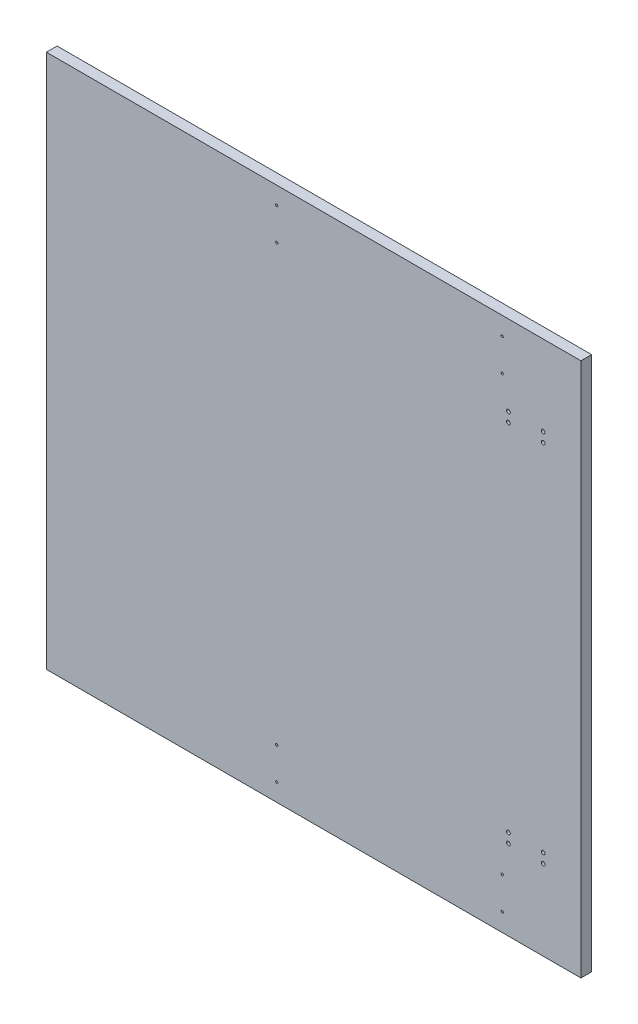
ISO-10303-21;
HEADER;
FILE_DESCRIPTION(('STEP AP214'),'2;1');
FILE_NAME('part.step','',(''),(''),'','','');
FILE_SCHEMA(('AUTOMOTIVE_DESIGN { 1 0 10303 214 1 1 1 1 }'));
ENDSEC;
DATA;
#1=APPLICATION_CONTEXT('core data for automotive mechanical design processes');
#2=APPLICATION_PROTOCOL_DEFINITION('international standard','automotive_design',2000,#1);
#3=PRODUCT_CONTEXT('',#1,'mechanical');
#4=PRODUCT('Part','Part','',(#3));
#5=PRODUCT_RELATED_PRODUCT_CATEGORY('part','',(#4));
#6=PRODUCT_DEFINITION_FORMATION('','',#4);
#7=PRODUCT_DEFINITION_CONTEXT('part definition',#1,'design');
#8=PRODUCT_DEFINITION('design','',#6,#7);
#9=PRODUCT_DEFINITION_SHAPE('','',#8);
#10=(LENGTH_UNIT() NAMED_UNIT(*) SI_UNIT(.MILLI.,.METRE.));
#11=(NAMED_UNIT(*) PLANE_ANGLE_UNIT() SI_UNIT($,.RADIAN.));
#12=(NAMED_UNIT(*) SI_UNIT($,.STERADIAN.) SOLID_ANGLE_UNIT());
#13=UNCERTAINTY_MEASURE_WITH_UNIT(LENGTH_MEASURE(1.E-05),#10,'distance_accuracy_value','');
#14=(GEOMETRIC_REPRESENTATION_CONTEXT(3) GLOBAL_UNCERTAINTY_ASSIGNED_CONTEXT((#13)) GLOBAL_UNIT_ASSIGNED_CONTEXT((#10,
#11,#12)) REPRESENTATION_CONTEXT('',''));
#15=CARTESIAN_POINT('',(0.,0.,0.));
#16=DIRECTION('',(0.,0.,1.));
#17=DIRECTION('',(1.,0.,0.));
#18=AXIS2_PLACEMENT_3D('',#15,#16,#17);
#19=CARTESIAN_POINT('',(0.,0.,0.));
#20=DIRECTION('',(0.,0.,-1.));
#21=DIRECTION('',(-1.,0.,0.));
#22=AXIS2_PLACEMENT_3D('',#19,#20,#21);
#23=PLANE('',#22);
#24=CARTESIAN_POINT('',(-69.0900000000001,-467.1625,0.));
#25=DIRECTION('',(0.,0.,1.));
#26=DIRECTION('',(1.,0.,0.));
#27=AXIS2_PLACEMENT_3D('',#24,#25,#26);
#28=CIRCLE('',#27,2.09999999999999);
#29=CARTESIAN_POINT('',(-66.9900000000001,-467.1625,0.));
#30=VERTEX_POINT('',#29);
#31=EDGE_CURVE('E207',#30,#30,#28,.T.);
#32=ORIENTED_EDGE('',*,*,#31,.T.);
#33=EDGE_LOOP('',(#32));
#34=FACE_BOUND('',#33,.T.);
#35=CARTESIAN_POINT('',(352.804,-405.8375,0.));
#36=DIRECTION('',(0.,0.,1.));
#37=DIRECTION('',(1.,0.,0.));
#38=AXIS2_PLACEMENT_3D('',#35,#36,#37);
#39=CIRCLE('',#38,2.09999999999999);
#40=CARTESIAN_POINT('',(354.904,-405.8375,0.));
#41=VERTEX_POINT('',#40);
#42=EDGE_CURVE('E195',#41,#41,#39,.T.);
#43=ORIENTED_EDGE('',*,*,#42,.T.);
#44=EDGE_LOOP('',(#43));
#45=FACE_BOUND('',#44,.T.);
#46=CARTESIAN_POINT('',(364.35,-350.,0.));
#47=DIRECTION('',(0.,0.,1.));
#48=DIRECTION('',(1.,0.,0.));
#49=AXIS2_PLACEMENT_3D('',#46,#47,#48);
#50=CIRCLE('',#49,3.5);
#51=CARTESIAN_POINT('',(367.85,-350.,0.));
#52=VERTEX_POINT('',#51);
#53=EDGE_CURVE('E189',#52,#52,#50,.T.);
#54=ORIENTED_EDGE('',*,*,#53,.T.);
#55=EDGE_LOOP('',(#54));
#56=FACE_BOUND('',#55,.T.);
#57=CARTESIAN_POINT('',(364.35,-332.,0.));
#58=DIRECTION('',(0.,0.,1.));
#59=DIRECTION('',(1.,0.,0.));
#60=AXIS2_PLACEMENT_3D('',#57,#58,#59);
#61=CIRCLE('',#60,3.5);
#62=CARTESIAN_POINT('',(367.85,-332.,0.));
#63=VERTEX_POINT('',#62);
#64=EDGE_CURVE('E183',#63,#63,#61,.T.);
#65=ORIENTED_EDGE('',*,*,#64,.T.);
#66=EDGE_LOOP('',(#65));
#67=FACE_BOUND('',#66,.T.);
#68=CARTESIAN_POINT('',(429.35,-332.,0.));
#69=DIRECTION('',(0.,0.,1.));
#70=DIRECTION('',(1.,0.,0.));
#71=AXIS2_PLACEMENT_3D('',#68,#69,#70);
#72=CIRCLE('',#71,3.5);
#73=CARTESIAN_POINT('',(432.85,-332.,0.));
#74=VERTEX_POINT('',#73);
#75=EDGE_CURVE('E177',#74,#74,#72,.T.);
#76=ORIENTED_EDGE('',*,*,#75,.T.);
#77=EDGE_LOOP('',(#76));
#78=FACE_BOUND('',#77,.T.);
#79=CARTESIAN_POINT('',(429.35,-350.,0.));
#80=DIRECTION('',(0.,0.,1.));
#81=DIRECTION('',(1.,0.,0.));
#82=AXIS2_PLACEMENT_3D('',#79,#80,#81);
#83=CIRCLE('',#82,3.5);
#84=CARTESIAN_POINT('',(432.85,-350.,0.));
#85=VERTEX_POINT('',#84);
#86=EDGE_CURVE('E171',#85,#85,#83,.T.);
#87=ORIENTED_EDGE('',*,*,#86,.T.);
#88=EDGE_LOOP('',(#87));
#89=FACE_BOUND('',#88,.T.);
#90=CARTESIAN_POINT('',(-69.0900000000001,406.8375,0.));
#91=DIRECTION('',(0.,0.,1.));
#92=DIRECTION('',(1.,0.,0.));
#93=AXIS2_PLACEMENT_3D('',#90,#91,#92);
#94=CIRCLE('',#93,2.09999999999999);
#95=CARTESIAN_POINT('',(-66.9900000000001,406.8375,0.));
#96=VERTEX_POINT('',#95);
#97=EDGE_CURVE('E165',#96,#96,#94,.T.);
#98=ORIENTED_EDGE('',*,*,#97,.T.);
#99=EDGE_LOOP('',(#98));
#100=FACE_BOUND('',#99,.T.);
#101=CARTESIAN_POINT('',(-69.0900000000001,467.1625,0.));
#102=DIRECTION('',(0.,0.,1.));
#103=DIRECTION('',(1.,0.,0.));
#104=AXIS2_PLACEMENT_3D('',#101,#102,#103);
#105=CIRCLE('',#104,2.09999999999999);
#106=CARTESIAN_POINT('',(-66.9900000000001,467.1625,0.));
#107=VERTEX_POINT('',#106);
#108=EDGE_CURVE('E159',#107,#107,#105,.T.);
#109=ORIENTED_EDGE('',*,*,#108,.T.);
#110=EDGE_LOOP('',(#109));
#111=FACE_BOUND('',#110,.T.);
#112=CARTESIAN_POINT('',(352.804,466.1625,0.));
#113=DIRECTION('',(0.,0.,1.));
#114=DIRECTION('',(1.,0.,0.));
#115=AXIS2_PLACEMENT_3D('',#112,#113,#114);
#116=CIRCLE('',#115,2.09999999999999);
#117=CARTESIAN_POINT('',(354.904,466.1625,0.));
#118=VERTEX_POINT('',#117);
#119=EDGE_CURVE('E153',#118,#118,#116,.T.);
#120=ORIENTED_EDGE('',*,*,#119,.T.);
#121=EDGE_LOOP('',(#120));
#122=FACE_BOUND('',#121,.T.);
#123=CARTESIAN_POINT('',(352.804,405.8375,0.));
#124=DIRECTION('',(0.,0.,1.));
#125=DIRECTION('',(1.,0.,0.));
#126=AXIS2_PLACEMENT_3D('',#123,#124,#125);
#127=CIRCLE('',#126,2.09999999999999);
#128=CARTESIAN_POINT('',(354.904,405.8375,0.));
#129=VERTEX_POINT('',#128);
#130=EDGE_CURVE('E147',#129,#129,#127,.T.);
#131=ORIENTED_EDGE('',*,*,#130,.T.);
#132=EDGE_LOOP('',(#131));
#133=FACE_BOUND('',#132,.T.);
#134=CARTESIAN_POINT('',(364.35,350.,0.));
#135=DIRECTION('',(0.,0.,1.));
#136=DIRECTION('',(1.,0.,0.));
#137=AXIS2_PLACEMENT_3D('',#134,#135,#136);
#138=CIRCLE('',#137,3.5);
#139=CARTESIAN_POINT('',(367.85,350.,0.));
#140=VERTEX_POINT('',#139);
#141=EDGE_CURVE('E141',#140,#140,#138,.T.);
#142=ORIENTED_EDGE('',*,*,#141,.T.);
#143=EDGE_LOOP('',(#142));
#144=FACE_BOUND('',#143,.T.);
#145=CARTESIAN_POINT('',(364.35,332.,0.));
#146=DIRECTION('',(0.,0.,1.));
#147=DIRECTION('',(1.,0.,0.));
#148=AXIS2_PLACEMENT_3D('',#145,#146,#147);
#149=CIRCLE('',#148,3.5);
#150=CARTESIAN_POINT('',(367.85,332.,0.));
#151=VERTEX_POINT('',#150);
#152=EDGE_CURVE('E135',#151,#151,#149,.T.);
#153=ORIENTED_EDGE('',*,*,#152,.T.);
#154=EDGE_LOOP('',(#153));
#155=FACE_BOUND('',#154,.T.);
#156=CARTESIAN_POINT('',(429.35,332.,0.));
#157=DIRECTION('',(0.,0.,1.));
#158=DIRECTION('',(1.,0.,0.));
#159=AXIS2_PLACEMENT_3D('',#156,#157,#158);
#160=CIRCLE('',#159,3.5);
#161=CARTESIAN_POINT('',(432.85,332.,0.));
#162=VERTEX_POINT('',#161);
#163=EDGE_CURVE('E129',#162,#162,#160,.T.);
#164=ORIENTED_EDGE('',*,*,#163,.T.);
#165=EDGE_LOOP('',(#164));
#166=FACE_BOUND('',#165,.T.);
#167=CARTESIAN_POINT('',(429.35,350.,0.));
#168=DIRECTION('',(0.,0.,1.));
#169=DIRECTION('',(1.,0.,0.));
#170=AXIS2_PLACEMENT_3D('',#167,#168,#169);
#171=CIRCLE('',#170,3.5);
#172=CARTESIAN_POINT('',(432.85,350.,0.));
#173=VERTEX_POINT('',#172);
#174=EDGE_CURVE('E113',#173,#173,#171,.T.);
#175=ORIENTED_EDGE('',*,*,#174,.T.);
#176=EDGE_LOOP('',(#175));
#177=FACE_BOUND('',#176,.T.);
#178=DIRECTION('',(0.,1.,0.));
#179=VECTOR('',#178,1.);
#180=CARTESIAN_POINT('',(500.,-500.,0.));
#181=LINE('',#180,#179);
#182=CARTESIAN_POINT('',(500.,-500.,0.));
#183=VERTEX_POINT('',#182);
#184=CARTESIAN_POINT('',(500.,500.,0.));
#185=VERTEX_POINT('',#184);
#186=EDGE_CURVE('E110',#183,#185,#181,.T.);
#187=ORIENTED_EDGE('',*,*,#186,.F.);
#188=DIRECTION('',(1.,0.,0.));
#189=VECTOR('',#188,1.);
#190=CARTESIAN_POINT('',(-500.,-500.,0.));
#191=LINE('',#190,#189);
#192=CARTESIAN_POINT('',(-500.,-500.,0.));
#193=VERTEX_POINT('',#192);
#194=EDGE_CURVE('E85',#193,#183,#191,.T.);
#195=ORIENTED_EDGE('',*,*,#194,.F.);
#196=DIRECTION('',(0.,-1.,0.));
#197=VECTOR('',#196,1.);
#198=CARTESIAN_POINT('',(-500.,-500.,0.));
#199=LINE('',#198,#197);
#200=CARTESIAN_POINT('',(-500.,500.,0.));
#201=VERTEX_POINT('',#200);
#202=EDGE_CURVE('E79',#201,#193,#199,.T.);
#203=ORIENTED_EDGE('',*,*,#202,.F.);
#204=DIRECTION('',(-1.,0.,0.));
#205=VECTOR('',#204,1.);
#206=CARTESIAN_POINT('',(-500.,500.,0.));
#207=LINE('',#206,#205);
#208=EDGE_CURVE('E102',#185,#201,#207,.T.);
#209=ORIENTED_EDGE('',*,*,#208,.F.);
#210=EDGE_LOOP('',(#187,#195,#203,#209));
#211=FACE_BOUND('',#210,.T.);
#212=CARTESIAN_POINT('',(352.804,-466.1625,0.));
#213=DIRECTION('',(0.,0.,1.));
#214=DIRECTION('',(1.,0.,0.));
#215=AXIS2_PLACEMENT_3D('',#212,#213,#214);
#216=CIRCLE('',#215,2.09999999999999);
#217=CARTESIAN_POINT('',(354.904,-466.1625,0.));
#218=VERTEX_POINT('',#217);
#219=EDGE_CURVE('E201',#218,#218,#216,.T.);
#220=ORIENTED_EDGE('',*,*,#219,.T.);
#221=EDGE_LOOP('',(#220));
#222=FACE_BOUND('',#221,.T.);
#223=CARTESIAN_POINT('',(-69.0900000000001,-406.8375,0.));
#224=DIRECTION('',(0.,0.,1.));
#225=DIRECTION('',(1.,0.,0.));
#226=AXIS2_PLACEMENT_3D('',#223,#224,#225);
#227=CIRCLE('',#226,2.09999999999999);
#228=CARTESIAN_POINT('',(-66.9900000000001,-406.8375,0.));
#229=VERTEX_POINT('',#228);
#230=EDGE_CURVE('E213',#229,#229,#227,.T.);
#231=ORIENTED_EDGE('',*,*,#230,.T.);
#232=EDGE_LOOP('',(#231));
#233=FACE_BOUND('',#232,.T.);
#234=ADVANCED_FACE('F45',(#34,#45,#56,#67,#78,#89,#100,#111,#122,#133,#144,#155,#166,#177,#211,
#222,#233),#23,.T.);
#235=CARTESIAN_POINT('',(0.,0.,20.));
#236=DIRECTION('',(0.,0.,-1.));
#237=DIRECTION('',(-1.,0.,0.));
#238=AXIS2_PLACEMENT_3D('',#235,#236,#237);
#239=PLANE('',#238);
#240=CARTESIAN_POINT('',(-69.0900000000001,-406.8375,20.));
#241=DIRECTION('',(0.,0.,1.));
#242=DIRECTION('',(1.,0.,0.));
#243=AXIS2_PLACEMENT_3D('',#240,#241,#242);
#244=CIRCLE('',#243,2.1);
#245=CARTESIAN_POINT('',(-66.9900000000001,-406.8375,20.));
#246=VERTEX_POINT('',#245);
#247=EDGE_CURVE('E216',#246,#246,#244,.T.);
#248=ORIENTED_EDGE('',*,*,#247,.F.);
#249=EDGE_LOOP('',(#248));
#250=FACE_BOUND('',#249,.T.);
#251=CARTESIAN_POINT('',(352.804,-405.8375,20.));
#252=DIRECTION('',(0.,0.,1.));
#253=DIRECTION('',(1.,0.,0.));
#254=AXIS2_PLACEMENT_3D('',#251,#252,#253);
#255=CIRCLE('',#254,2.09999999999999);
#256=CARTESIAN_POINT('',(354.904,-405.8375,20.));
#257=VERTEX_POINT('',#256);
#258=EDGE_CURVE('E198',#257,#257,#255,.T.);
#259=ORIENTED_EDGE('',*,*,#258,.F.);
#260=EDGE_LOOP('',(#259));
#261=FACE_BOUND('',#260,.T.);
#262=CARTESIAN_POINT('',(364.35,-350.,20.));
#263=DIRECTION('',(0.,0.,1.));
#264=DIRECTION('',(1.,0.,0.));
#265=AXIS2_PLACEMENT_3D('',#262,#263,#264);
#266=CIRCLE('',#265,3.5);
#267=CARTESIAN_POINT('',(367.85,-350.,20.));
#268=VERTEX_POINT('',#267);
#269=EDGE_CURVE('E192',#268,#268,#266,.T.);
#270=ORIENTED_EDGE('',*,*,#269,.F.);
#271=EDGE_LOOP('',(#270));
#272=FACE_BOUND('',#271,.T.);
#273=CARTESIAN_POINT('',(364.35,-332.,20.));
#274=DIRECTION('',(0.,0.,1.));
#275=DIRECTION('',(1.,0.,0.));
#276=AXIS2_PLACEMENT_3D('',#273,#274,#275);
#277=CIRCLE('',#276,3.5);
#278=CARTESIAN_POINT('',(367.85,-332.,20.));
#279=VERTEX_POINT('',#278);
#280=EDGE_CURVE('E186',#279,#279,#277,.T.);
#281=ORIENTED_EDGE('',*,*,#280,.F.);
#282=EDGE_LOOP('',(#281));
#283=FACE_BOUND('',#282,.T.);
#284=CARTESIAN_POINT('',(429.35,-332.,20.));
#285=DIRECTION('',(0.,0.,1.));
#286=DIRECTION('',(1.,0.,0.));
#287=AXIS2_PLACEMENT_3D('',#284,#285,#286);
#288=CIRCLE('',#287,3.5);
#289=CARTESIAN_POINT('',(432.85,-332.,20.));
#290=VERTEX_POINT('',#289);
#291=EDGE_CURVE('E180',#290,#290,#288,.T.);
#292=ORIENTED_EDGE('',*,*,#291,.F.);
#293=EDGE_LOOP('',(#292));
#294=FACE_BOUND('',#293,.T.);
#295=CARTESIAN_POINT('',(429.35,-350.,20.));
#296=DIRECTION('',(0.,0.,1.));
#297=DIRECTION('',(1.,0.,0.));
#298=AXIS2_PLACEMENT_3D('',#295,#296,#297);
#299=CIRCLE('',#298,3.5);
#300=CARTESIAN_POINT('',(432.85,-350.,20.));
#301=VERTEX_POINT('',#300);
#302=EDGE_CURVE('E174',#301,#301,#299,.T.);
#303=ORIENTED_EDGE('',*,*,#302,.F.);
#304=EDGE_LOOP('',(#303));
#305=FACE_BOUND('',#304,.T.);
#306=CARTESIAN_POINT('',(-69.0900000000001,406.8375,20.));
#307=DIRECTION('',(0.,0.,1.));
#308=DIRECTION('',(1.,0.,0.));
#309=AXIS2_PLACEMENT_3D('',#306,#307,#308);
#310=CIRCLE('',#309,2.1);
#311=CARTESIAN_POINT('',(-66.9900000000001,406.8375,20.));
#312=VERTEX_POINT('',#311);
#313=EDGE_CURVE('E168',#312,#312,#310,.T.);
#314=ORIENTED_EDGE('',*,*,#313,.F.);
#315=EDGE_LOOP('',(#314));
#316=FACE_BOUND('',#315,.T.);
#317=CARTESIAN_POINT('',(-69.0900000000001,467.1625,20.));
#318=DIRECTION('',(0.,0.,1.));
#319=DIRECTION('',(1.,0.,0.));
#320=AXIS2_PLACEMENT_3D('',#317,#318,#319);
#321=CIRCLE('',#320,2.1);
#322=CARTESIAN_POINT('',(-66.9900000000001,467.1625,20.));
#323=VERTEX_POINT('',#322);
#324=EDGE_CURVE('E162',#323,#323,#321,.T.);
#325=ORIENTED_EDGE('',*,*,#324,.F.);
#326=EDGE_LOOP('',(#325));
#327=FACE_BOUND('',#326,.T.);
#328=CARTESIAN_POINT('',(352.804,466.1625,20.));
#329=DIRECTION('',(0.,0.,1.));
#330=DIRECTION('',(1.,0.,0.));
#331=AXIS2_PLACEMENT_3D('',#328,#329,#330);
#332=CIRCLE('',#331,2.09999999999999);
#333=CARTESIAN_POINT('',(354.904,466.1625,20.));
#334=VERTEX_POINT('',#333);
#335=EDGE_CURVE('E156',#334,#334,#332,.T.);
#336=ORIENTED_EDGE('',*,*,#335,.F.);
#337=EDGE_LOOP('',(#336));
#338=FACE_BOUND('',#337,.T.);
#339=CARTESIAN_POINT('',(352.804,405.8375,20.));
#340=DIRECTION('',(0.,0.,1.));
#341=DIRECTION('',(1.,0.,0.));
#342=AXIS2_PLACEMENT_3D('',#339,#340,#341);
#343=CIRCLE('',#342,2.09999999999999);
#344=CARTESIAN_POINT('',(354.904,405.8375,20.));
#345=VERTEX_POINT('',#344);
#346=EDGE_CURVE('E150',#345,#345,#343,.T.);
#347=ORIENTED_EDGE('',*,*,#346,.F.);
#348=EDGE_LOOP('',(#347));
#349=FACE_BOUND('',#348,.T.);
#350=CARTESIAN_POINT('',(364.35,350.,20.));
#351=DIRECTION('',(0.,0.,1.));
#352=DIRECTION('',(1.,0.,0.));
#353=AXIS2_PLACEMENT_3D('',#350,#351,#352);
#354=CIRCLE('',#353,3.5);
#355=CARTESIAN_POINT('',(367.85,350.,20.));
#356=VERTEX_POINT('',#355);
#357=EDGE_CURVE('E144',#356,#356,#354,.T.);
#358=ORIENTED_EDGE('',*,*,#357,.F.);
#359=EDGE_LOOP('',(#358));
#360=FACE_BOUND('',#359,.T.);
#361=CARTESIAN_POINT('',(364.35,332.,20.));
#362=DIRECTION('',(0.,0.,1.));
#363=DIRECTION('',(1.,0.,0.));
#364=AXIS2_PLACEMENT_3D('',#361,#362,#363);
#365=CIRCLE('',#364,3.5);
#366=CARTESIAN_POINT('',(367.85,332.,20.));
#367=VERTEX_POINT('',#366);
#368=EDGE_CURVE('E138',#367,#367,#365,.T.);
#369=ORIENTED_EDGE('',*,*,#368,.F.);
#370=EDGE_LOOP('',(#369));
#371=FACE_BOUND('',#370,.T.);
#372=CARTESIAN_POINT('',(429.35,332.,20.));
#373=DIRECTION('',(0.,0.,1.));
#374=DIRECTION('',(1.,0.,0.));
#375=AXIS2_PLACEMENT_3D('',#372,#373,#374);
#376=CIRCLE('',#375,3.5);
#377=CARTESIAN_POINT('',(432.85,332.,20.));
#378=VERTEX_POINT('',#377);
#379=EDGE_CURVE('E132',#378,#378,#376,.T.);
#380=ORIENTED_EDGE('',*,*,#379,.F.);
#381=EDGE_LOOP('',(#380));
#382=FACE_BOUND('',#381,.T.);
#383=CARTESIAN_POINT('',(429.35,350.,20.));
#384=DIRECTION('',(0.,0.,1.));
#385=DIRECTION('',(1.,0.,0.));
#386=AXIS2_PLACEMENT_3D('',#383,#384,#385);
#387=CIRCLE('',#386,3.5);
#388=CARTESIAN_POINT('',(432.85,350.,20.));
#389=VERTEX_POINT('',#388);
#390=EDGE_CURVE('E126',#389,#389,#387,.T.);
#391=ORIENTED_EDGE('',*,*,#390,.F.);
#392=EDGE_LOOP('',(#391));
#393=FACE_BOUND('',#392,.T.);
#394=DIRECTION('',(0.,1.,0.));
#395=VECTOR('',#394,1.);
#396=CARTESIAN_POINT('',(500.,-500.,20.));
#397=LINE('',#396,#395);
#398=CARTESIAN_POINT('',(500.,-500.,20.));
#399=VERTEX_POINT('',#398);
#400=CARTESIAN_POINT('',(500.,500.,20.));
#401=VERTEX_POINT('',#400);
#402=EDGE_CURVE('E98',#399,#401,#397,.T.);
#403=ORIENTED_EDGE('',*,*,#402,.T.);
#404=DIRECTION('',(-1.,0.,0.));
#405=VECTOR('',#404,1.);
#406=CARTESIAN_POINT('',(-500.,500.,20.));
#407=LINE('',#406,#405);
#408=CARTESIAN_POINT('',(-500.,500.,20.));
#409=VERTEX_POINT('',#408);
#410=EDGE_CURVE('E92',#401,#409,#407,.T.);
#411=ORIENTED_EDGE('',*,*,#410,.T.);
#412=DIRECTION('',(0.,-1.,0.));
#413=VECTOR('',#412,1.);
#414=CARTESIAN_POINT('',(-500.,-500.,20.));
#415=LINE('',#414,#413);
#416=CARTESIAN_POINT('',(-500.,-500.,20.));
#417=VERTEX_POINT('',#416);
#418=EDGE_CURVE('E96',#409,#417,#415,.T.);
#419=ORIENTED_EDGE('',*,*,#418,.T.);
#420=DIRECTION('',(1.,0.,0.));
#421=VECTOR('',#420,1.);
#422=CARTESIAN_POINT('',(-500.,-500.,20.));
#423=LINE('',#422,#421);
#424=EDGE_CURVE('E62',#417,#399,#423,.T.);
#425=ORIENTED_EDGE('',*,*,#424,.T.);
#426=EDGE_LOOP('',(#403,#411,#419,#425));
#427=FACE_BOUND('',#426,.T.);
#428=CARTESIAN_POINT('',(352.804,-466.1625,20.));
#429=DIRECTION('',(0.,0.,1.));
#430=DIRECTION('',(1.,0.,0.));
#431=AXIS2_PLACEMENT_3D('',#428,#429,#430);
#432=CIRCLE('',#431,2.09999999999999);
#433=CARTESIAN_POINT('',(354.904,-466.1625,20.));
#434=VERTEX_POINT('',#433);
#435=EDGE_CURVE('E204',#434,#434,#432,.T.);
#436=ORIENTED_EDGE('',*,*,#435,.F.);
#437=EDGE_LOOP('',(#436));
#438=FACE_BOUND('',#437,.T.);
#439=CARTESIAN_POINT('',(-69.0900000000001,-467.1625,20.));
#440=DIRECTION('',(0.,0.,1.));
#441=DIRECTION('',(1.,0.,0.));
#442=AXIS2_PLACEMENT_3D('',#439,#440,#441);
#443=CIRCLE('',#442,2.1);
#444=CARTESIAN_POINT('',(-66.9900000000001,-467.1625,20.));
#445=VERTEX_POINT('',#444);
#446=EDGE_CURVE('E210',#445,#445,#443,.T.);
#447=ORIENTED_EDGE('',*,*,#446,.F.);
#448=EDGE_LOOP('',(#447));
#449=FACE_BOUND('',#448,.T.);
#450=ADVANCED_FACE('F93',(#250,#261,#272,#283,#294,#305,#316,#327,#338,#349,#360,#371,#382,#393,
#427,#438,#449),#239,.F.);
#451=CARTESIAN_POINT('',(500.,-500.,20.));
#452=DIRECTION('',(-1.,0.,0.));
#453=DIRECTION('',(0.,0.,1.));
#454=AXIS2_PLACEMENT_3D('',#451,#452,#453);
#455=PLANE('',#454);
#456=ORIENTED_EDGE('',*,*,#186,.T.);
#457=DIRECTION('',(0.,0.,-1.));
#458=VECTOR('',#457,1.);
#459=CARTESIAN_POINT('',(500.,500.,20.));
#460=LINE('',#459,#458);
#461=EDGE_CURVE('E11',#401,#185,#460,.T.);
#462=ORIENTED_EDGE('',*,*,#461,.F.);
#463=ORIENTED_EDGE('',*,*,#402,.F.);
#464=DIRECTION('',(0.,0.,-1.));
#465=VECTOR('',#464,1.);
#466=CARTESIAN_POINT('',(500.,-500.,20.));
#467=LINE('',#466,#465);
#468=EDGE_CURVE('E106',#399,#183,#467,.T.);
#469=ORIENTED_EDGE('',*,*,#468,.T.);
#470=EDGE_LOOP('',(#456,#462,#463,#469));
#471=FACE_BOUND('',#470,.T.);
#472=ADVANCED_FACE('F47',(#471),#455,.F.);
#473=CARTESIAN_POINT('',(-500.,500.,20.));
#474=DIRECTION('',(0.,-1.,0.));
#475=DIRECTION('',(0.,0.,-1.));
#476=AXIS2_PLACEMENT_3D('',#473,#474,#475);
#477=PLANE('',#476);
#478=ORIENTED_EDGE('',*,*,#208,.T.);
#479=DIRECTION('',(0.,0.,-1.));
#480=VECTOR('',#479,1.);
#481=CARTESIAN_POINT('',(-500.,500.,20.));
#482=LINE('',#481,#480);
#483=EDGE_CURVE('E54',#409,#201,#482,.T.);
#484=ORIENTED_EDGE('',*,*,#483,.F.);
#485=ORIENTED_EDGE('',*,*,#410,.F.);
#486=ORIENTED_EDGE('',*,*,#461,.T.);
#487=EDGE_LOOP('',(#478,#484,#485,#486));
#488=FACE_BOUND('',#487,.T.);
#489=ADVANCED_FACE('F101',(#488),#477,.F.);
#490=CARTESIAN_POINT('',(-500.,-500.,20.));
#491=DIRECTION('',(1.,0.,0.));
#492=DIRECTION('',(0.,0.,-1.));
#493=AXIS2_PLACEMENT_3D('',#490,#491,#492);
#494=PLANE('',#493);
#495=ORIENTED_EDGE('',*,*,#202,.T.);
#496=DIRECTION('',(0.,0.,-1.));
#497=VECTOR('',#496,1.);
#498=CARTESIAN_POINT('',(-500.,-500.,20.));
#499=LINE('',#498,#497);
#500=EDGE_CURVE('E103',#417,#193,#499,.T.);
#501=ORIENTED_EDGE('',*,*,#500,.F.);
#502=ORIENTED_EDGE('',*,*,#418,.F.);
#503=ORIENTED_EDGE('',*,*,#483,.T.);
#504=EDGE_LOOP('',(#495,#501,#502,#503));
#505=FACE_BOUND('',#504,.T.);
#506=ADVANCED_FACE('F104',(#505),#494,.F.);
#507=CARTESIAN_POINT('',(-500.,-500.,20.));
#508=DIRECTION('',(0.,1.,0.));
#509=DIRECTION('',(0.,0.,1.));
#510=AXIS2_PLACEMENT_3D('',#507,#508,#509);
#511=PLANE('',#510);
#512=ORIENTED_EDGE('',*,*,#194,.T.);
#513=ORIENTED_EDGE('',*,*,#468,.F.);
#514=ORIENTED_EDGE('',*,*,#424,.F.);
#515=ORIENTED_EDGE('',*,*,#500,.T.);
#516=EDGE_LOOP('',(#512,#513,#514,#515));
#517=FACE_BOUND('',#516,.T.);
#518=ADVANCED_FACE('F118',(#517),#511,.F.);
#519=CARTESIAN_POINT('',(429.35,350.,20.));
#520=DIRECTION('',(0.,0.,1.));
#521=DIRECTION('',(1.,0.,0.));
#522=AXIS2_PLACEMENT_3D('',#519,#520,#521);
#523=CYLINDRICAL_SURFACE('',#522,3.5);
#524=ORIENTED_EDGE('',*,*,#174,.F.);
#525=EDGE_LOOP('',(#524));
#526=FACE_BOUND('',#525,.T.);
#527=ORIENTED_EDGE('',*,*,#390,.T.);
#528=EDGE_LOOP('',(#527));
#529=FACE_BOUND('',#528,.T.);
#530=ADVANCED_FACE('F251',(#526,#529),#523,.F.);
#531=CARTESIAN_POINT('',(429.35,332.,20.));
#532=DIRECTION('',(0.,0.,1.));
#533=DIRECTION('',(1.,0.,0.));
#534=AXIS2_PLACEMENT_3D('',#531,#532,#533);
#535=CYLINDRICAL_SURFACE('',#534,3.5);
#536=ORIENTED_EDGE('',*,*,#163,.F.);
#537=EDGE_LOOP('',(#536));
#538=FACE_BOUND('',#537,.T.);
#539=ORIENTED_EDGE('',*,*,#379,.T.);
#540=EDGE_LOOP('',(#539));
#541=FACE_BOUND('',#540,.T.);
#542=ADVANCED_FACE('F253',(#538,#541),#535,.F.);
#543=CARTESIAN_POINT('',(364.35,332.,20.));
#544=DIRECTION('',(0.,0.,1.));
#545=DIRECTION('',(1.,0.,0.));
#546=AXIS2_PLACEMENT_3D('',#543,#544,#545);
#547=CYLINDRICAL_SURFACE('',#546,3.5);
#548=ORIENTED_EDGE('',*,*,#152,.F.);
#549=EDGE_LOOP('',(#548));
#550=FACE_BOUND('',#549,.T.);
#551=ORIENTED_EDGE('',*,*,#368,.T.);
#552=EDGE_LOOP('',(#551));
#553=FACE_BOUND('',#552,.T.);
#554=ADVANCED_FACE('F260',(#550,#553),#547,.F.);
#555=CARTESIAN_POINT('',(364.35,350.,20.));
#556=DIRECTION('',(0.,0.,1.));
#557=DIRECTION('',(1.,0.,0.));
#558=AXIS2_PLACEMENT_3D('',#555,#556,#557);
#559=CYLINDRICAL_SURFACE('',#558,3.5);
#560=ORIENTED_EDGE('',*,*,#141,.F.);
#561=EDGE_LOOP('',(#560));
#562=FACE_BOUND('',#561,.T.);
#563=ORIENTED_EDGE('',*,*,#357,.T.);
#564=EDGE_LOOP('',(#563));
#565=FACE_BOUND('',#564,.T.);
#566=ADVANCED_FACE('F383',(#562,#565),#559,.F.);
#567=CARTESIAN_POINT('',(352.804,405.8375,20.));
#568=DIRECTION('',(0.,0.,1.));
#569=DIRECTION('',(1.,0.,0.));
#570=AXIS2_PLACEMENT_3D('',#567,#568,#569);
#571=CYLINDRICAL_SURFACE('',#570,2.09999999999999);
#572=ORIENTED_EDGE('',*,*,#130,.F.);
#573=EDGE_LOOP('',(#572));
#574=FACE_BOUND('',#573,.T.);
#575=ORIENTED_EDGE('',*,*,#346,.T.);
#576=EDGE_LOOP('',(#575));
#577=FACE_BOUND('',#576,.T.);
#578=ADVANCED_FACE('F376',(#574,#577),#571,.F.);
#579=CARTESIAN_POINT('',(352.804,466.1625,20.));
#580=DIRECTION('',(0.,0.,1.));
#581=DIRECTION('',(1.,0.,0.));
#582=AXIS2_PLACEMENT_3D('',#579,#580,#581);
#583=CYLINDRICAL_SURFACE('',#582,2.09999999999999);
#584=ORIENTED_EDGE('',*,*,#119,.F.);
#585=EDGE_LOOP('',(#584));
#586=FACE_BOUND('',#585,.T.);
#587=ORIENTED_EDGE('',*,*,#335,.T.);
#588=EDGE_LOOP('',(#587));
#589=FACE_BOUND('',#588,.T.);
#590=ADVANCED_FACE('F382',(#586,#589),#583,.F.);
#591=CARTESIAN_POINT('',(-69.0900000000001,467.1625,20.));
#592=DIRECTION('',(0.,0.,1.));
#593=DIRECTION('',(1.,0.,0.));
#594=AXIS2_PLACEMENT_3D('',#591,#592,#593);
#595=CYLINDRICAL_SURFACE('',#594,2.1);
#596=ORIENTED_EDGE('',*,*,#108,.F.);
#597=EDGE_LOOP('',(#596));
#598=FACE_BOUND('',#597,.T.);
#599=ORIENTED_EDGE('',*,*,#324,.T.);
#600=EDGE_LOOP('',(#599));
#601=FACE_BOUND('',#600,.T.);
#602=ADVANCED_FACE('F396',(#598,#601),#595,.F.);
#603=CARTESIAN_POINT('',(-69.0900000000001,406.8375,20.));
#604=DIRECTION('',(0.,0.,1.));
#605=DIRECTION('',(1.,0.,0.));
#606=AXIS2_PLACEMENT_3D('',#603,#604,#605);
#607=CYLINDRICAL_SURFACE('',#606,2.1);
#608=ORIENTED_EDGE('',*,*,#97,.F.);
#609=EDGE_LOOP('',(#608));
#610=FACE_BOUND('',#609,.T.);
#611=ORIENTED_EDGE('',*,*,#313,.T.);
#612=EDGE_LOOP('',(#611));
#613=FACE_BOUND('',#612,.T.);
#614=ADVANCED_FACE('F368',(#610,#613),#607,.F.);
#615=CARTESIAN_POINT('',(429.35,-350.,20.));
#616=DIRECTION('',(0.,0.,1.));
#617=DIRECTION('',(1.,0.,0.));
#618=AXIS2_PLACEMENT_3D('',#615,#616,#617);
#619=CYLINDRICAL_SURFACE('',#618,3.5);
#620=ORIENTED_EDGE('',*,*,#86,.F.);
#621=EDGE_LOOP('',(#620));
#622=FACE_BOUND('',#621,.T.);
#623=ORIENTED_EDGE('',*,*,#302,.T.);
#624=EDGE_LOOP('',(#623));
#625=FACE_BOUND('',#624,.T.);
#626=ADVANCED_FACE('F357',(#622,#625),#619,.F.);
#627=CARTESIAN_POINT('',(429.35,-332.,20.));
#628=DIRECTION('',(0.,0.,1.));
#629=DIRECTION('',(1.,0.,0.));
#630=AXIS2_PLACEMENT_3D('',#627,#628,#629);
#631=CYLINDRICAL_SURFACE('',#630,3.5);
#632=ORIENTED_EDGE('',*,*,#75,.F.);
#633=EDGE_LOOP('',(#632));
#634=FACE_BOUND('',#633,.T.);
#635=ORIENTED_EDGE('',*,*,#291,.T.);
#636=EDGE_LOOP('',(#635));
#637=FACE_BOUND('',#636,.T.);
#638=ADVANCED_FACE('F347',(#634,#637),#631,.F.);
#639=CARTESIAN_POINT('',(364.35,-332.,20.));
#640=DIRECTION('',(0.,0.,1.));
#641=DIRECTION('',(1.,0.,0.));
#642=AXIS2_PLACEMENT_3D('',#639,#640,#641);
#643=CYLINDRICAL_SURFACE('',#642,3.5);
#644=ORIENTED_EDGE('',*,*,#64,.F.);
#645=EDGE_LOOP('',(#644));
#646=FACE_BOUND('',#645,.T.);
#647=ORIENTED_EDGE('',*,*,#280,.T.);
#648=EDGE_LOOP('',(#647));
#649=FACE_BOUND('',#648,.T.);
#650=ADVANCED_FACE('F337',(#646,#649),#643,.F.);
#651=CARTESIAN_POINT('',(364.35,-350.,20.));
#652=DIRECTION('',(0.,0.,1.));
#653=DIRECTION('',(1.,0.,0.));
#654=AXIS2_PLACEMENT_3D('',#651,#652,#653);
#655=CYLINDRICAL_SURFACE('',#654,3.5);
#656=ORIENTED_EDGE('',*,*,#53,.F.);
#657=EDGE_LOOP('',(#656));
#658=FACE_BOUND('',#657,.T.);
#659=ORIENTED_EDGE('',*,*,#269,.T.);
#660=EDGE_LOOP('',(#659));
#661=FACE_BOUND('',#660,.T.);
#662=ADVANCED_FACE('F326',(#658,#661),#655,.F.);
#663=CARTESIAN_POINT('',(352.804,-405.8375,20.));
#664=DIRECTION('',(0.,0.,1.));
#665=DIRECTION('',(1.,0.,0.));
#666=AXIS2_PLACEMENT_3D('',#663,#664,#665);
#667=CYLINDRICAL_SURFACE('',#666,2.09999999999999);
#668=ORIENTED_EDGE('',*,*,#42,.F.);
#669=EDGE_LOOP('',(#668));
#670=FACE_BOUND('',#669,.T.);
#671=ORIENTED_EDGE('',*,*,#258,.T.);
#672=EDGE_LOOP('',(#671));
#673=FACE_BOUND('',#672,.T.);
#674=ADVANCED_FACE('F315',(#670,#673),#667,.F.);
#675=CARTESIAN_POINT('',(352.804,-466.1625,20.));
#676=DIRECTION('',(0.,0.,1.));
#677=DIRECTION('',(1.,0.,0.));
#678=AXIS2_PLACEMENT_3D('',#675,#676,#677);
#679=CYLINDRICAL_SURFACE('',#678,2.09999999999999);
#680=ORIENTED_EDGE('',*,*,#219,.F.);
#681=EDGE_LOOP('',(#680));
#682=FACE_BOUND('',#681,.T.);
#683=ORIENTED_EDGE('',*,*,#435,.T.);
#684=EDGE_LOOP('',(#683));
#685=FACE_BOUND('',#684,.T.);
#686=ADVANCED_FACE('F307',(#682,#685),#679,.F.);
#687=CARTESIAN_POINT('',(-69.0900000000001,-467.1625,20.));
#688=DIRECTION('',(0.,0.,1.));
#689=DIRECTION('',(1.,0.,0.));
#690=AXIS2_PLACEMENT_3D('',#687,#688,#689);
#691=CYLINDRICAL_SURFACE('',#690,2.1);
#692=ORIENTED_EDGE('',*,*,#31,.F.);
#693=EDGE_LOOP('',(#692));
#694=FACE_BOUND('',#693,.T.);
#695=ORIENTED_EDGE('',*,*,#446,.T.);
#696=EDGE_LOOP('',(#695));
#697=FACE_BOUND('',#696,.T.);
#698=ADVANCED_FACE('F290',(#694,#697),#691,.F.);
#699=CARTESIAN_POINT('',(-69.0900000000001,-406.8375,20.));
#700=DIRECTION('',(0.,0.,1.));
#701=DIRECTION('',(1.,0.,0.));
#702=AXIS2_PLACEMENT_3D('',#699,#700,#701);
#703=CYLINDRICAL_SURFACE('',#702,2.1);
#704=ORIENTED_EDGE('',*,*,#230,.F.);
#705=EDGE_LOOP('',(#704));
#706=FACE_BOUND('',#705,.T.);
#707=ORIENTED_EDGE('',*,*,#247,.T.);
#708=EDGE_LOOP('',(#707));
#709=FACE_BOUND('',#708,.T.);
#710=ADVANCED_FACE('F220',(#706,#709),#703,.F.);
#711=CLOSED_SHELL('',(#234,#450,#472,#489,#506,#518,#530,#542,#554,#566,#578,#590,#602,#614,
#626,#638,#650,#662,#674,#686,#698,#710));
#712=MANIFOLD_SOLID_BREP('B2',#711);
#713=ADVANCED_BREP_SHAPE_REPRESENTATION('',(#18,#712),#14);
#714=SHAPE_DEFINITION_REPRESENTATION(#9,#713);
ENDSEC;
END-ISO-10303-21;
